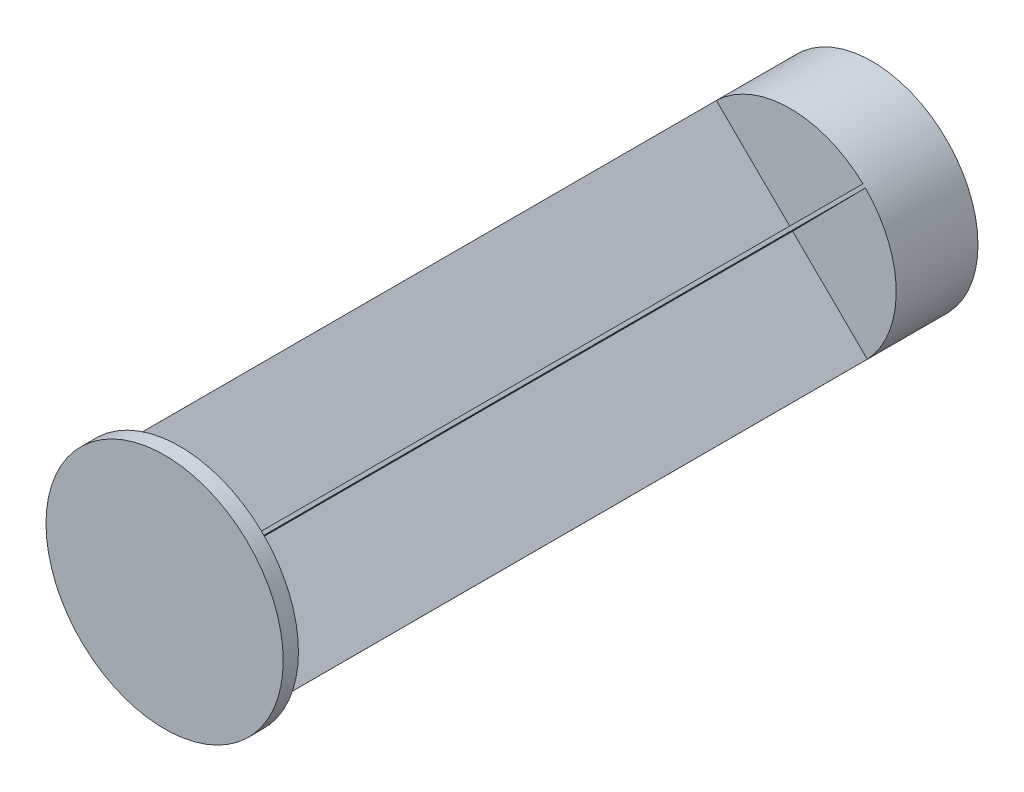
ISO-10303-21;
HEADER;
FILE_DESCRIPTION(('STEP AP214'),'2;1');
FILE_NAME('part.step','',(''),(''),'','','');
FILE_SCHEMA(('AUTOMOTIVE_DESIGN { 1 0 10303 214 1 1 1 1 }'));
ENDSEC;
DATA;
#1=APPLICATION_CONTEXT('core data for automotive mechanical design processes');
#2=APPLICATION_PROTOCOL_DEFINITION('international standard','automotive_design',2000,#1);
#3=PRODUCT_CONTEXT('',#1,'mechanical');
#4=PRODUCT('Part','Part','',(#3));
#5=PRODUCT_RELATED_PRODUCT_CATEGORY('part','',(#4));
#6=PRODUCT_DEFINITION_FORMATION('','',#4);
#7=PRODUCT_DEFINITION_CONTEXT('part definition',#1,'design');
#8=PRODUCT_DEFINITION('design','',#6,#7);
#9=PRODUCT_DEFINITION_SHAPE('','',#8);
#10=(LENGTH_UNIT() NAMED_UNIT(*) SI_UNIT(.MILLI.,.METRE.));
#11=(NAMED_UNIT(*) PLANE_ANGLE_UNIT() SI_UNIT($,.RADIAN.));
#12=(NAMED_UNIT(*) SI_UNIT($,.STERADIAN.) SOLID_ANGLE_UNIT());
#13=UNCERTAINTY_MEASURE_WITH_UNIT(LENGTH_MEASURE(1.E-05),#10,'distance_accuracy_value','');
#14=(GEOMETRIC_REPRESENTATION_CONTEXT(3) GLOBAL_UNCERTAINTY_ASSIGNED_CONTEXT((#13)) GLOBAL_UNIT_ASSIGNED_CONTEXT((#10,
#11,#12)) REPRESENTATION_CONTEXT('',''));
#15=CARTESIAN_POINT('',(0.,0.,0.));
#16=DIRECTION('',(0.,0.,1.));
#17=DIRECTION('',(1.,0.,0.));
#18=AXIS2_PLACEMENT_3D('',#15,#16,#17);
#19=CARTESIAN_POINT('',(0.,0.,18.));
#20=DIRECTION('',(0.,0.,1.));
#21=DIRECTION('',(1.,0.,0.));
#22=AXIS2_PLACEMENT_3D('',#19,#20,#21);
#23=PLANE('',#22);
#24=CARTESIAN_POINT('',(0.,0.,18.));
#25=DIRECTION('',(0.,0.,1.));
#26=DIRECTION('',(1.,0.,0.));
#27=AXIS2_PLACEMENT_3D('',#24,#25,#26);
#28=CIRCLE('',#27,23.31);
#29=CARTESIAN_POINT('',(15.9980061641728,16.9534627368892,18.));
#30=VERTEX_POINT('',#29);
#31=CARTESIAN_POINT('',(-16.2517047998913,16.710421631341,18.));
#32=VERTEX_POINT('',#31);
#33=EDGE_CURVE('E300',#30,#32,#28,.T.);
#34=ORIENTED_EDGE('',*,*,#33,.T.);
#35=DIRECTION('',(0.712415467168224,-0.701757936997852,0.));
#36=VECTOR('',#35,1.);
#37=CARTESIAN_POINT('',(0.350878968498927,0.356207733584114,18.));
#38=LINE('',#37,#36);
#39=CARTESIAN_POINT('',(-0.00532876508519228,0.707086702083047,18.));
#40=VERTEX_POINT('',#39);
#41=EDGE_CURVE('E13',#32,#40,#38,.T.);
#42=ORIENTED_EDGE('',*,*,#41,.T.);
#43=DIRECTION('',(-0.701757936997852,-0.712415467168224,0.));
#44=VECTOR('',#43,1.);
#45=CARTESIAN_POINT('',(-0.35620773358412,0.350878968498934,18.));
#46=LINE('',#45,#44);
#47=EDGE_CURVE('E424',#30,#40,#46,.T.);
#48=ORIENTED_EDGE('',*,*,#47,.F.);
#49=EDGE_LOOP('',(#34,#42,#48));
#50=FACE_BOUND('',#49,.T.);
#51=ADVANCED_FACE('F214',(#50),#23,.T.);
#52=CARTESIAN_POINT('',(-16.1789328223973,-16.7808889135336,18.));
#53=VERTEX_POINT('',#52);
#54=CARTESIAN_POINT('',(16.2517047998913,-16.710421631341,18.));
#55=VERTEX_POINT('',#54);
#56=EDGE_CURVE('E295',#53,#55,#28,.T.);
#57=ORIENTED_EDGE('',*,*,#56,.T.);
#58=DIRECTION('',(-0.712415467168224,0.701757936997852,0.));
#59=VECTOR('',#58,1.);
#60=CARTESIAN_POINT('',(-0.350878968498924,-0.35620773358411,18.));
#61=LINE('',#60,#59);
#62=CARTESIAN_POINT('',(-0.172775101706872,-0.531647217833568,18.));
#63=VERTEX_POINT('',#62);
#64=EDGE_CURVE('E224',#55,#63,#61,.T.);
#65=ORIENTED_EDGE('',*,*,#64,.T.);
#66=DIRECTION('',(0.701757936997851,0.712415467168224,0.));
#67=VECTOR('',#66,1.);
#68=CARTESIAN_POINT('',(0.178103866792051,-0.175439484249458,18.));
#69=LINE('',#68,#67);
#70=EDGE_CURVE('E285',#53,#63,#69,.T.);
#71=ORIENTED_EDGE('',*,*,#70,.F.);
#72=EDGE_LOOP('',(#57,#65,#71));
#73=FACE_BOUND('',#72,.T.);
#74=ADVANCED_FACE('F294',(#73),#23,.T.);
#75=DIRECTION('',(0.701757936997851,0.712415467168224,0.));
#76=VECTOR('',#75,1.);
#77=CARTESIAN_POINT('',(0.178103866792051,-0.175439484249458,18.));
#78=LINE('',#77,#76);
#79=CARTESIAN_POINT('',(0.528982835290978,0.180768249334656,18.));
#80=VERTEX_POINT('',#79);
#81=CARTESIAN_POINT('',(16.5351405559814,16.4300099450347,18.));
#82=VERTEX_POINT('',#81);
#83=EDGE_CURVE('E417',#80,#82,#78,.T.);
#84=ORIENTED_EDGE('',*,*,#83,.F.);
#85=DIRECTION('',(0.712415467168224,-0.701757936997852,0.));
#86=VECTOR('',#85,1.);
#87=CARTESIAN_POINT('',(0.350878968498927,0.356207733584114,18.));
#88=LINE('',#87,#86);
#89=CARTESIAN_POINT('',(16.9534627368892,-15.9980061641728,18.));
#90=VERTEX_POINT('',#89);
#91=EDGE_CURVE('E305',#80,#90,#88,.T.);
#92=ORIENTED_EDGE('',*,*,#91,.T.);
#93=EDGE_CURVE('E308',#90,#82,#28,.T.);
#94=ORIENTED_EDGE('',*,*,#93,.T.);
#95=EDGE_LOOP('',(#84,#92,#94));
#96=FACE_BOUND('',#95,.T.);
#97=ADVANCED_FACE('F484',(#96),#23,.T.);
#98=CARTESIAN_POINT('',(0.,0.,15.));
#99=DIRECTION('',(0.,0.,-1.));
#100=DIRECTION('',(-1.,0.,0.));
#101=AXIS2_PLACEMENT_3D('',#98,#99,#100);
#102=CYLINDRICAL_SURFACE('',#101,23.31);
#103=DIRECTION('',(0.,0.,-1.));
#104=VECTOR('',#103,1.);
#105=CARTESIAN_POINT('',(-16.710421631341,-16.2517047998913,152.3));
#106=LINE('',#105,#104);
#107=CARTESIAN_POINT('',(-16.710421631341,-16.2517047998913,152.3));
#108=VERTEX_POINT('',#107);
#109=CARTESIAN_POINT('',(-16.710421631341,-16.2517047998913,18.));
#110=VERTEX_POINT('',#109);
#111=EDGE_CURVE('E344',#108,#110,#106,.T.);
#112=ORIENTED_EDGE('',*,*,#111,.T.);
#113=CARTESIAN_POINT('',(-16.9534627368892,15.9980061641728,18.));
#114=VERTEX_POINT('',#113);
#115=EDGE_CURVE('E317',#114,#110,#28,.T.);
#116=ORIENTED_EDGE('',*,*,#115,.F.);
#117=DIRECTION('',(0.,0.,-1.));
#118=VECTOR('',#117,1.);
#119=CARTESIAN_POINT('',(-16.9534627368892,15.9980061641728,222.));
#120=LINE('',#119,#118);
#121=CARTESIAN_POINT('',(-16.9534627368892,15.9980061641728,152.3));
#122=VERTEX_POINT('',#121);
#123=EDGE_CURVE('E307',#114,#122,#120,.F.);
#124=ORIENTED_EDGE('',*,*,#123,.T.);
#125=CARTESIAN_POINT('',(0.,0.,152.3));
#126=DIRECTION('',(0.,0.,1.));
#127=DIRECTION('',(1.,0.,0.));
#128=AXIS2_PLACEMENT_3D('',#125,#126,#127);
#129=CIRCLE('',#128,23.31);
#130=CARTESIAN_POINT('',(-16.2517047998913,16.710421631341,152.3));
#131=VERTEX_POINT('',#130);
#132=EDGE_CURVE('E390',#122,#131,#129,.F.);
#133=ORIENTED_EDGE('',*,*,#132,.T.);
#134=DIRECTION('',(0.,0.,-1.));
#135=VECTOR('',#134,1.);
#136=CARTESIAN_POINT('',(-16.2517047998913,16.710421631341,222.));
#137=LINE('',#136,#135);
#138=EDGE_CURVE('E394',#131,#32,#137,.T.);
#139=ORIENTED_EDGE('',*,*,#138,.T.);
#140=ORIENTED_EDGE('',*,*,#33,.F.);
#141=DIRECTION('',(0.,0.,-1.));
#142=VECTOR('',#141,1.);
#143=CARTESIAN_POINT('',(15.9980061641728,16.9534627368892,152.3));
#144=LINE('',#143,#142);
#145=CARTESIAN_POINT('',(15.9980061641728,16.9534627368892,152.3));
#146=VERTEX_POINT('',#145);
#147=EDGE_CURVE('E410',#146,#30,#144,.T.);
#148=ORIENTED_EDGE('',*,*,#147,.F.);
#149=CARTESIAN_POINT('',(0.,0.,152.3));
#150=DIRECTION('',(0.,0.,1.));
#151=DIRECTION('',(1.,0.,0.));
#152=AXIS2_PLACEMENT_3D('',#149,#150,#151);
#153=CIRCLE('',#152,23.31);
#154=CARTESIAN_POINT('',(16.5351405559814,16.4300099450347,152.3));
#155=VERTEX_POINT('',#154);
#156=EDGE_CURVE('E413',#155,#146,#153,.T.);
#157=ORIENTED_EDGE('',*,*,#156,.F.);
#158=DIRECTION('',(0.,0.,-1.));
#159=VECTOR('',#158,1.);
#160=CARTESIAN_POINT('',(16.5351405559814,16.4300099450347,152.3));
#161=LINE('',#160,#159);
#162=EDGE_CURVE('E423',#155,#82,#161,.T.);
#163=ORIENTED_EDGE('',*,*,#162,.T.);
#164=ORIENTED_EDGE('',*,*,#93,.F.);
#165=DIRECTION('',(0.,0.,-1.));
#166=VECTOR('',#165,1.);
#167=CARTESIAN_POINT('',(16.9534627368892,-15.9980061641728,222.));
#168=LINE('',#167,#166);
#169=CARTESIAN_POINT('',(16.9534627368892,-15.9980061641728,152.3));
#170=VERTEX_POINT('',#169);
#171=EDGE_CURVE('E232',#90,#170,#168,.F.);
#172=ORIENTED_EDGE('',*,*,#171,.T.);
#173=CARTESIAN_POINT('',(16.2517047998913,-16.710421631341,152.3));
#174=VERTEX_POINT('',#173);
#175=EDGE_CURVE('E385',#170,#174,#129,.F.);
#176=ORIENTED_EDGE('',*,*,#175,.T.);
#177=DIRECTION('',(0.,0.,-1.));
#178=VECTOR('',#177,1.);
#179=CARTESIAN_POINT('',(16.2517047998913,-16.710421631341,222.));
#180=LINE('',#179,#178);
#181=EDGE_CURVE('E387',#174,#55,#180,.T.);
#182=ORIENTED_EDGE('',*,*,#181,.T.);
#183=ORIENTED_EDGE('',*,*,#56,.F.);
#184=DIRECTION('',(0.,0.,-1.));
#185=VECTOR('',#184,1.);
#186=CARTESIAN_POINT('',(-16.1789328223973,-16.7808889135336,152.3));
#187=LINE('',#186,#185);
#188=CARTESIAN_POINT('',(-16.1789328223973,-16.7808889135336,152.3));
#189=VERTEX_POINT('',#188);
#190=EDGE_CURVE('E281',#189,#53,#187,.T.);
#191=ORIENTED_EDGE('',*,*,#190,.F.);
#192=CARTESIAN_POINT('',(0.,0.,152.3));
#193=DIRECTION('',(0.,0.,1.));
#194=DIRECTION('',(1.,0.,0.));
#195=AXIS2_PLACEMENT_3D('',#192,#193,#194);
#196=CIRCLE('',#195,23.31);
#197=EDGE_CURVE('E440',#108,#189,#196,.T.);
#198=ORIENTED_EDGE('',*,*,#197,.F.);
#199=EDGE_LOOP('',(#112,#116,#124,#133,#139,#140,#148,#157,#163,#164,#172,#176,#182,#183,#191,#198));
#200=FACE_BOUND('',#199,.T.);
#201=CARTESIAN_POINT('',(0.,0.,0.));
#202=DIRECTION('',(0.,0.,1.));
#203=DIRECTION('',(1.,0.,0.));
#204=AXIS2_PLACEMENT_3D('',#201,#202,#203);
#205=CIRCLE('',#204,23.31);
#206=CARTESIAN_POINT('',(23.31,0.,0.));
#207=VERTEX_POINT('',#206);
#208=EDGE_CURVE('E218',#207,#207,#205,.T.);
#209=ORIENTED_EDGE('',*,*,#208,.T.);
#210=EDGE_LOOP('',(#209));
#211=FACE_BOUND('',#210,.T.);
#212=ADVANCED_FACE('F216',(#200,#211),#102,.T.);
#213=CARTESIAN_POINT('',(0.,0.,0.));
#214=DIRECTION('',(0.,0.,1.));
#215=DIRECTION('',(1.,0.,0.));
#216=AXIS2_PLACEMENT_3D('',#213,#214,#215);
#217=PLANE('',#216);
#218=ORIENTED_EDGE('',*,*,#208,.F.);
#219=EDGE_LOOP('',(#218));
#220=FACE_BOUND('',#219,.T.);
#221=ADVANCED_FACE('F487',(#220),#217,.F.);
#222=DIRECTION('',(-0.701757936997852,-0.712415467168224,0.));
#223=VECTOR('',#222,1.);
#224=CARTESIAN_POINT('',(-0.35620773358412,0.350878968498934,18.));
#225=LINE('',#224,#223);
#226=CARTESIAN_POINT('',(-0.707086702083044,-0.00532876508517623,18.));
#227=VERTEX_POINT('',#226);
#228=EDGE_CURVE('E292',#227,#110,#225,.T.);
#229=ORIENTED_EDGE('',*,*,#228,.F.);
#230=DIRECTION('',(-0.712415467168224,0.701757936997852,0.));
#231=VECTOR('',#230,1.);
#232=CARTESIAN_POINT('',(-0.350878968498924,-0.35620773358411,18.));
#233=LINE('',#232,#231);
#234=EDGE_CURVE('E333',#227,#114,#233,.T.);
#235=ORIENTED_EDGE('',*,*,#234,.T.);
#236=ORIENTED_EDGE('',*,*,#115,.T.);
#237=EDGE_LOOP('',(#229,#235,#236));
#238=FACE_BOUND('',#237,.T.);
#239=ADVANCED_FACE('F331',(#238),#23,.T.);
#240=CARTESIAN_POINT('',(-0.350878968498924,-0.35620773358411,152.3));
#241=DIRECTION('',(-0.701757936997852,-0.712415467168224,0.));
#242=DIRECTION('',(0.712415467168224,-0.701757936997852,0.));
#243=AXIS2_PLACEMENT_3D('',#240,#241,#242);
#244=PLANE('',#243);
#245=ORIENTED_EDGE('',*,*,#123,.F.);
#246=ORIENTED_EDGE('',*,*,#234,.F.);
#247=DIRECTION('',(0.,0.,-1.));
#248=VECTOR('',#247,1.);
#249=CARTESIAN_POINT('',(-0.707086702083044,-0.00532876508517623,152.3));
#250=LINE('',#249,#248);
#251=CARTESIAN_POINT('',(-0.707086702083044,-0.00532876508517623,152.3));
#252=VERTEX_POINT('',#251);
#253=EDGE_CURVE('E241',#252,#227,#250,.T.);
#254=ORIENTED_EDGE('',*,*,#253,.F.);
#255=DIRECTION('',(-0.712415467168224,0.701757936997852,0.));
#256=VECTOR('',#255,1.);
#257=CARTESIAN_POINT('',(-0.350878968498924,-0.35620773358411,152.3));
#258=LINE('',#257,#256);
#259=EDGE_CURVE('E405',#252,#122,#258,.T.);
#260=ORIENTED_EDGE('',*,*,#259,.T.);
#261=EDGE_LOOP('',(#245,#246,#254,#260));
#262=FACE_BOUND('',#261,.T.);
#263=ADVANCED_FACE('F467',(#262),#244,.T.);
#264=CARTESIAN_POINT('',(0.350878968498927,0.356207733584114,152.3));
#265=DIRECTION('',(0.701757936997852,0.712415467168224,0.));
#266=DIRECTION('',(-0.712415467168224,0.701757936997852,0.));
#267=AXIS2_PLACEMENT_3D('',#264,#265,#266);
#268=PLANE('',#267);
#269=ORIENTED_EDGE('',*,*,#138,.F.);
#270=DIRECTION('',(0.712415467168224,-0.701757936997852,0.));
#271=VECTOR('',#270,1.);
#272=CARTESIAN_POINT('',(0.350878968498927,0.356207733584114,152.3));
#273=LINE('',#272,#271);
#274=CARTESIAN_POINT('',(-0.00532876508519228,0.707086702083047,152.3));
#275=VERTEX_POINT('',#274);
#276=EDGE_CURVE('E401',#131,#275,#273,.T.);
#277=ORIENTED_EDGE('',*,*,#276,.T.);
#278=DIRECTION('',(0.,0.,-1.));
#279=VECTOR('',#278,1.);
#280=CARTESIAN_POINT('',(-0.00532876508519228,0.707086702083047,152.3));
#281=LINE('',#280,#279);
#282=EDGE_CURVE('E311',#275,#40,#281,.T.);
#283=ORIENTED_EDGE('',*,*,#282,.T.);
#284=ORIENTED_EDGE('',*,*,#41,.F.);
#285=EDGE_LOOP('',(#269,#277,#283,#284));
#286=FACE_BOUND('',#285,.T.);
#287=ADVANCED_FACE('F466',(#286),#268,.T.);
#288=CARTESIAN_POINT('',(20.9235726700506,-21.3123997039414,152.3));
#289=DIRECTION('',(-0.701757936997852,-0.712415467168224,0.));
#290=DIRECTION('',(0.712415467168224,-0.701757936997852,0.));
#291=AXIS2_PLACEMENT_3D('',#288,#289,#290);
#292=PLANE('',#291);
#293=ORIENTED_EDGE('',*,*,#181,.F.);
#294=DIRECTION('',(-0.712415467168224,0.701757936997852,0.));
#295=VECTOR('',#294,1.);
#296=CARTESIAN_POINT('',(-0.350878968498924,-0.35620773358411,152.3));
#297=LINE('',#296,#295);
#298=CARTESIAN_POINT('',(-0.172775101706872,-0.531647217833568,152.3));
#299=VERTEX_POINT('',#298);
#300=EDGE_CURVE('E277',#174,#299,#297,.T.);
#301=ORIENTED_EDGE('',*,*,#300,.T.);
#302=DIRECTION('',(0.,0.,-1.));
#303=VECTOR('',#302,1.);
#304=CARTESIAN_POINT('',(-0.172775101706872,-0.531647217833568,152.3));
#305=LINE('',#304,#303);
#306=EDGE_CURVE('E270',#299,#63,#305,.T.);
#307=ORIENTED_EDGE('',*,*,#306,.T.);
#308=ORIENTED_EDGE('',*,*,#64,.F.);
#309=EDGE_LOOP('',(#293,#301,#307,#308));
#310=FACE_BOUND('',#309,.T.);
#311=ADVANCED_FACE('F273',(#310),#292,.T.);
#312=CARTESIAN_POINT('',(-19.0008647096654,19.4184549007881,152.3));
#313=DIRECTION('',(0.701757936997852,0.712415467168224,0.));
#314=DIRECTION('',(-0.712415467168224,0.701757936997852,0.));
#315=AXIS2_PLACEMENT_3D('',#312,#313,#314);
#316=PLANE('',#315);
#317=ORIENTED_EDGE('',*,*,#171,.F.);
#318=ORIENTED_EDGE('',*,*,#91,.F.);
#319=DIRECTION('',(0.,0.,-1.));
#320=VECTOR('',#319,1.);
#321=CARTESIAN_POINT('',(0.528982835290978,0.180768249334656,152.3));
#322=LINE('',#321,#320);
#323=CARTESIAN_POINT('',(0.528982835290978,0.180768249334656,152.3));
#324=VERTEX_POINT('',#323);
#325=EDGE_CURVE('E433',#324,#80,#322,.T.);
#326=ORIENTED_EDGE('',*,*,#325,.F.);
#327=DIRECTION('',(0.712415467168224,-0.701757936997852,0.));
#328=VECTOR('',#327,1.);
#329=CARTESIAN_POINT('',(0.350878968498927,0.356207733584114,152.3));
#330=LINE('',#329,#328);
#331=EDGE_CURVE('E303',#324,#170,#330,.T.);
#332=ORIENTED_EDGE('',*,*,#331,.T.);
#333=EDGE_LOOP('',(#317,#318,#326,#332));
#334=FACE_BOUND('',#333,.T.);
#335=ADVANCED_FACE('F452',(#334),#316,.T.);
#336=CARTESIAN_POINT('',(0.178103866792051,-0.175439484249458,152.3));
#337=DIRECTION('',(-0.712415467168224,0.701757936997851,0.));
#338=DIRECTION('',(-0.701757936997851,-0.712415467168224,0.));
#339=AXIS2_PLACEMENT_3D('',#336,#337,#338);
#340=PLANE('',#339);
#341=ORIENTED_EDGE('',*,*,#83,.T.);
#342=ORIENTED_EDGE('',*,*,#162,.F.);
#343=DIRECTION('',(0.701757936997851,0.712415467168224,0.));
#344=VECTOR('',#343,1.);
#345=CARTESIAN_POINT('',(0.178103866792051,-0.175439484249458,152.3));
#346=LINE('',#345,#344);
#347=EDGE_CURVE('E420',#324,#155,#346,.T.);
#348=ORIENTED_EDGE('',*,*,#347,.F.);
#349=ORIENTED_EDGE('',*,*,#325,.T.);
#350=EDGE_LOOP('',(#341,#342,#348,#349));
#351=FACE_BOUND('',#350,.T.);
#352=ADVANCED_FACE('F458',(#351),#340,.F.);
#353=CARTESIAN_POINT('',(0.178103866792051,-0.175439484249458,152.3));
#354=DIRECTION('',(-0.712415467168224,0.701757936997851,0.));
#355=DIRECTION('',(-0.701757936997851,-0.712415467168224,0.));
#356=AXIS2_PLACEMENT_3D('',#353,#354,#355);
#357=PLANE('',#356);
#358=ORIENTED_EDGE('',*,*,#70,.T.);
#359=ORIENTED_EDGE('',*,*,#306,.F.);
#360=DIRECTION('',(0.701757936997851,0.712415467168224,0.));
#361=VECTOR('',#360,1.);
#362=CARTESIAN_POINT('',(0.178103866792051,-0.175439484249458,152.3));
#363=LINE('',#362,#361);
#364=EDGE_CURVE('E282',#189,#299,#363,.T.);
#365=ORIENTED_EDGE('',*,*,#364,.F.);
#366=ORIENTED_EDGE('',*,*,#190,.T.);
#367=EDGE_LOOP('',(#358,#359,#365,#366));
#368=FACE_BOUND('',#367,.T.);
#369=ADVANCED_FACE('F286',(#368),#357,.F.);
#370=CARTESIAN_POINT('',(-0.35620773358412,0.350878968498934,152.3));
#371=DIRECTION('',(0.712415467168224,-0.701757936997852,0.));
#372=DIRECTION('',(0.701757936997852,0.712415467168224,0.));
#373=AXIS2_PLACEMENT_3D('',#370,#371,#372);
#374=PLANE('',#373);
#375=ORIENTED_EDGE('',*,*,#228,.T.);
#376=ORIENTED_EDGE('',*,*,#111,.F.);
#377=DIRECTION('',(-0.701757936997852,-0.712415467168224,0.));
#378=VECTOR('',#377,1.);
#379=CARTESIAN_POINT('',(-0.35620773358412,0.350878968498934,152.3));
#380=LINE('',#379,#378);
#381=EDGE_CURVE('E291',#252,#108,#380,.T.);
#382=ORIENTED_EDGE('',*,*,#381,.F.);
#383=ORIENTED_EDGE('',*,*,#253,.T.);
#384=EDGE_LOOP('',(#375,#376,#382,#383));
#385=FACE_BOUND('',#384,.T.);
#386=ADVANCED_FACE('F468',(#385),#374,.F.);
#387=CARTESIAN_POINT('',(-0.35620773358412,0.350878968498934,152.3));
#388=DIRECTION('',(0.712415467168224,-0.701757936997852,0.));
#389=DIRECTION('',(0.701757936997852,0.712415467168224,0.));
#390=AXIS2_PLACEMENT_3D('',#387,#388,#389);
#391=PLANE('',#390);
#392=ORIENTED_EDGE('',*,*,#47,.T.);
#393=ORIENTED_EDGE('',*,*,#282,.F.);
#394=DIRECTION('',(-0.701757936997852,-0.712415467168224,0.));
#395=VECTOR('',#394,1.);
#396=CARTESIAN_POINT('',(-0.35620773358412,0.350878968498934,152.3));
#397=LINE('',#396,#395);
#398=EDGE_CURVE('E416',#146,#275,#397,.T.);
#399=ORIENTED_EDGE('',*,*,#398,.F.);
#400=ORIENTED_EDGE('',*,*,#147,.T.);
#401=EDGE_LOOP('',(#392,#393,#399,#400));
#402=FACE_BOUND('',#401,.T.);
#403=ADVANCED_FACE('F461',(#402),#391,.F.);
#404=CARTESIAN_POINT('',(0.,0.,155.65));
#405=DIRECTION('',(0.,0.,-1.));
#406=DIRECTION('',(-1.,0.,0.));
#407=AXIS2_PLACEMENT_3D('',#404,#405,#406);
#408=CYLINDRICAL_SURFACE('',#407,26.095);
#409=CARTESIAN_POINT('',(0.,0.,155.65));
#410=DIRECTION('',(0.,0.,1.));
#411=DIRECTION('',(1.,0.,0.));
#412=AXIS2_PLACEMENT_3D('',#409,#410,#411);
#413=CIRCLE('',#412,26.095);
#414=CARTESIAN_POINT('',(26.095,0.,155.65));
#415=VERTEX_POINT('',#414);
#416=EDGE_CURVE('E664',#415,#415,#413,.T.);
#417=ORIENTED_EDGE('',*,*,#416,.F.);
#418=EDGE_LOOP('',(#417));
#419=FACE_BOUND('',#418,.T.);
#420=CARTESIAN_POINT('',(0.,0.,152.3));
#421=DIRECTION('',(0.,0.,1.));
#422=DIRECTION('',(1.,0.,0.));
#423=AXIS2_PLACEMENT_3D('',#420,#421,#422);
#424=CIRCLE('',#423,26.095);
#425=CARTESIAN_POINT('',(26.095,0.,152.3));
#426=VERTEX_POINT('',#425);
#427=EDGE_CURVE('E666',#426,#426,#424,.T.);
#428=ORIENTED_EDGE('',*,*,#427,.T.);
#429=EDGE_LOOP('',(#428));
#430=FACE_BOUND('',#429,.T.);
#431=ADVANCED_FACE('F475',(#419,#430),#408,.T.);
#432=CARTESIAN_POINT('',(0.,0.,155.65));
#433=DIRECTION('',(0.,0.,1.));
#434=DIRECTION('',(1.,0.,0.));
#435=AXIS2_PLACEMENT_3D('',#432,#433,#434);
#436=PLANE('',#435);
#437=ORIENTED_EDGE('',*,*,#416,.T.);
#438=EDGE_LOOP('',(#437));
#439=FACE_BOUND('',#438,.T.);
#440=ADVANCED_FACE('F635',(#439),#436,.T.);
#441=CARTESIAN_POINT('',(0.,0.,152.3));
#442=DIRECTION('',(0.,0.,1.));
#443=DIRECTION('',(1.,0.,0.));
#444=AXIS2_PLACEMENT_3D('',#441,#442,#443);
#445=PLANE('',#444);
#446=ORIENTED_EDGE('',*,*,#175,.F.);
#447=ORIENTED_EDGE('',*,*,#331,.F.);
#448=ORIENTED_EDGE('',*,*,#347,.T.);
#449=ORIENTED_EDGE('',*,*,#156,.T.);
#450=ORIENTED_EDGE('',*,*,#398,.T.);
#451=ORIENTED_EDGE('',*,*,#276,.F.);
#452=ORIENTED_EDGE('',*,*,#132,.F.);
#453=ORIENTED_EDGE('',*,*,#259,.F.);
#454=ORIENTED_EDGE('',*,*,#381,.T.);
#455=ORIENTED_EDGE('',*,*,#197,.T.);
#456=ORIENTED_EDGE('',*,*,#364,.T.);
#457=ORIENTED_EDGE('',*,*,#300,.F.);
#458=EDGE_LOOP('',(#446,#447,#448,#449,#450,#451,#452,#453,#454,#455,#456,#457));
#459=FACE_BOUND('',#458,.T.);
#460=ORIENTED_EDGE('',*,*,#427,.F.);
#461=EDGE_LOOP('',(#460));
#462=FACE_BOUND('',#461,.T.);
#463=ADVANCED_FACE('F383',(#459,#462),#445,.F.);
#464=CLOSED_SHELL('',(#51,#74,#97,#212,#221,#239,#263,#287,#311,#335,#352,#369,#386,#403,#431,
#440,#463));
#465=MANIFOLD_SOLID_BREP('B2',#464);
#466=ADVANCED_BREP_SHAPE_REPRESENTATION('',(#18,#465),#14);
#467=SHAPE_DEFINITION_REPRESENTATION(#9,#466);
ENDSEC;
END-ISO-10303-21;
